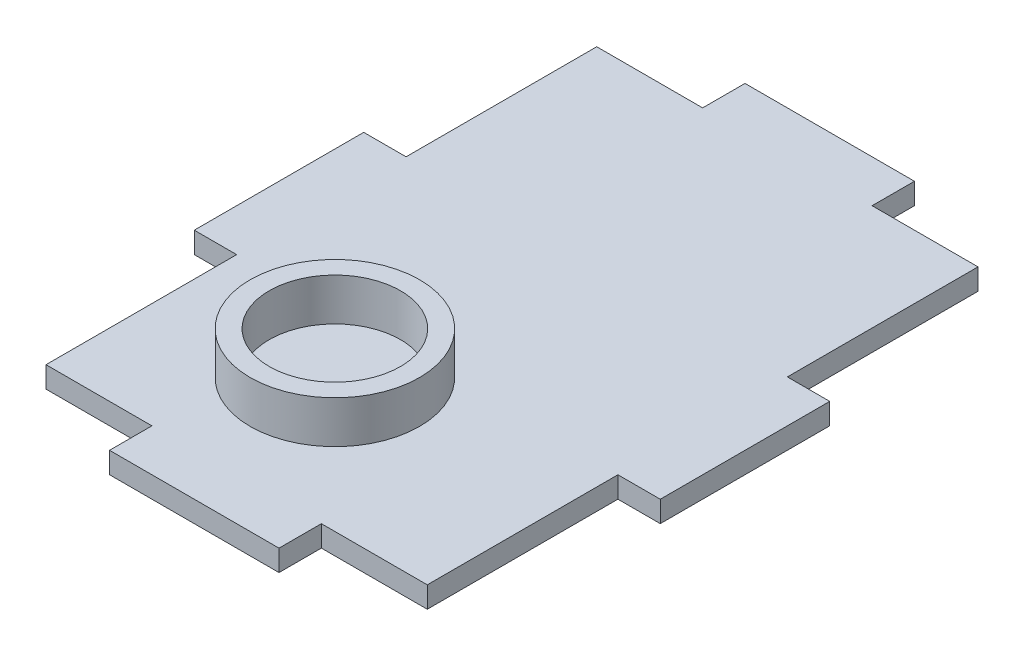
ISO-10303-21;
HEADER;
FILE_DESCRIPTION(('STEP AP214'),'2;1');
FILE_NAME('part.step','',(''),(''),'','','');
FILE_SCHEMA(('AUTOMOTIVE_DESIGN { 1 0 10303 214 1 1 1 1 }'));
ENDSEC;
DATA;
#1=APPLICATION_CONTEXT('core data for automotive mechanical design processes');
#2=APPLICATION_PROTOCOL_DEFINITION('international standard','automotive_design',2000,#1);
#3=PRODUCT_CONTEXT('',#1,'mechanical');
#4=PRODUCT('Part','Part','',(#3));
#5=PRODUCT_RELATED_PRODUCT_CATEGORY('part','',(#4));
#6=PRODUCT_DEFINITION_FORMATION('','',#4);
#7=PRODUCT_DEFINITION_CONTEXT('part definition',#1,'design');
#8=PRODUCT_DEFINITION('design','',#6,#7);
#9=PRODUCT_DEFINITION_SHAPE('','',#8);
#10=(LENGTH_UNIT() NAMED_UNIT(*) SI_UNIT(.MILLI.,.METRE.));
#11=(NAMED_UNIT(*) PLANE_ANGLE_UNIT() SI_UNIT($,.RADIAN.));
#12=(NAMED_UNIT(*) SI_UNIT($,.STERADIAN.) SOLID_ANGLE_UNIT());
#13=UNCERTAINTY_MEASURE_WITH_UNIT(LENGTH_MEASURE(1.E-05),#10,'distance_accuracy_value','');
#14=(GEOMETRIC_REPRESENTATION_CONTEXT(3) GLOBAL_UNCERTAINTY_ASSIGNED_CONTEXT((#13)) GLOBAL_UNIT_ASSIGNED_CONTEXT((#10,
#11,#12)) REPRESENTATION_CONTEXT('',''));
#15=CARTESIAN_POINT('',(0.,0.,0.));
#16=DIRECTION('',(0.,0.,1.));
#17=DIRECTION('',(1.,0.,0.));
#18=AXIS2_PLACEMENT_3D('',#15,#16,#17);
#19=CARTESIAN_POINT('',(0.,5.,0.));
#20=DIRECTION('',(-1.,0.,0.));
#21=DIRECTION('',(0.,0.,1.));
#22=AXIS2_PLACEMENT_3D('',#19,#20,#21);
#23=PLANE('',#22);
#24=DIRECTION('',(0.,0.,-1.));
#25=VECTOR('',#24,1.);
#26=CARTESIAN_POINT('',(0.,0.,0.));
#27=LINE('',#26,#25);
#28=CARTESIAN_POINT('',(0.,0.,0.));
#29=VERTEX_POINT('',#28);
#30=CARTESIAN_POINT('',(0.,0.,-45.));
#31=VERTEX_POINT('',#30);
#32=EDGE_CURVE('E163',#29,#31,#27,.T.);
#33=ORIENTED_EDGE('',*,*,#32,.F.);
#34=DIRECTION('',(0.,-1.,0.));
#35=VECTOR('',#34,1.);
#36=CARTESIAN_POINT('',(0.,5.,0.));
#37=LINE('',#36,#35);
#38=CARTESIAN_POINT('',(0.,5.,0.));
#39=VERTEX_POINT('',#38);
#40=EDGE_CURVE('E156',#39,#29,#37,.T.);
#41=ORIENTED_EDGE('',*,*,#40,.F.);
#42=DIRECTION('',(0.,0.,-1.));
#43=VECTOR('',#42,1.);
#44=CARTESIAN_POINT('',(0.,5.,0.));
#45=LINE('',#44,#43);
#46=CARTESIAN_POINT('',(0.,5.,-45.));
#47=VERTEX_POINT('',#46);
#48=EDGE_CURVE('E159',#39,#47,#45,.T.);
#49=ORIENTED_EDGE('',*,*,#48,.T.);
#50=DIRECTION('',(0.,-1.,0.));
#51=VECTOR('',#50,1.);
#52=CARTESIAN_POINT('',(0.,5.,-45.));
#53=LINE('',#52,#51);
#54=EDGE_CURVE('E153',#47,#31,#53,.T.);
#55=ORIENTED_EDGE('',*,*,#54,.T.);
#56=EDGE_LOOP('',(#33,#41,#49,#55));
#57=FACE_BOUND('',#56,.T.);
#58=ADVANCED_FACE('F35',(#57),#23,.T.);
#59=CARTESIAN_POINT('',(0.,5.,-45.));
#60=DIRECTION('',(0.,0.,1.));
#61=DIRECTION('',(1.,0.,0.));
#62=AXIS2_PLACEMENT_3D('',#59,#60,#61);
#63=PLANE('',#62);
#64=DIRECTION('',(-1.,0.,0.));
#65=VECTOR('',#64,1.);
#66=CARTESIAN_POINT('',(0.,0.,-45.));
#67=LINE('',#66,#65);
#68=CARTESIAN_POINT('',(-9.99999999999999,0.,-45.));
#69=VERTEX_POINT('',#68);
#70=EDGE_CURVE('E160',#31,#69,#67,.T.);
#71=ORIENTED_EDGE('',*,*,#70,.F.);
#72=ORIENTED_EDGE('',*,*,#54,.F.);
#73=DIRECTION('',(-1.,0.,0.));
#74=VECTOR('',#73,1.);
#75=CARTESIAN_POINT('',(0.,5.,-45.));
#76=LINE('',#75,#74);
#77=CARTESIAN_POINT('',(-9.99999999999999,5.,-45.));
#78=VERTEX_POINT('',#77);
#79=EDGE_CURVE('E201',#47,#78,#76,.T.);
#80=ORIENTED_EDGE('',*,*,#79,.T.);
#81=DIRECTION('',(0.,-1.,0.));
#82=VECTOR('',#81,1.);
#83=CARTESIAN_POINT('',(-9.99999999999999,5.,-45.));
#84=LINE('',#83,#82);
#85=EDGE_CURVE('E150',#78,#69,#84,.T.);
#86=ORIENTED_EDGE('',*,*,#85,.T.);
#87=EDGE_LOOP('',(#71,#72,#80,#86));
#88=FACE_BOUND('',#87,.T.);
#89=ADVANCED_FACE('F414',(#88),#63,.T.);
#90=CARTESIAN_POINT('',(-9.99999999999999,5.,0.));
#91=DIRECTION('',(1.,0.,0.));
#92=DIRECTION('',(0.,0.,-1.));
#93=AXIS2_PLACEMENT_3D('',#90,#91,#92);
#94=PLANE('',#93);
#95=DIRECTION('',(0.,0.,1.));
#96=VECTOR('',#95,1.);
#97=CARTESIAN_POINT('',(-9.99999999999999,0.,0.));
#98=LINE('',#97,#96);
#99=CARTESIAN_POINT('',(-9.99999999999999,0.,-85.));
#100=VERTEX_POINT('',#99);
#101=EDGE_CURVE('E164',#100,#69,#98,.T.);
#102=ORIENTED_EDGE('',*,*,#101,.T.);
#103=ORIENTED_EDGE('',*,*,#85,.F.);
#104=DIRECTION('',(0.,0.,1.));
#105=VECTOR('',#104,1.);
#106=CARTESIAN_POINT('',(-9.99999999999999,5.,0.));
#107=LINE('',#106,#105);
#108=CARTESIAN_POINT('',(-9.99999999999999,5.,-85.));
#109=VERTEX_POINT('',#108);
#110=EDGE_CURVE('E204',#109,#78,#107,.T.);
#111=ORIENTED_EDGE('',*,*,#110,.F.);
#112=DIRECTION('',(0.,-1.,0.));
#113=VECTOR('',#112,1.);
#114=CARTESIAN_POINT('',(-9.99999999999999,5.,-85.));
#115=LINE('',#114,#113);
#116=EDGE_CURVE('E147',#109,#100,#115,.T.);
#117=ORIENTED_EDGE('',*,*,#116,.T.);
#118=EDGE_LOOP('',(#102,#103,#111,#117));
#119=FACE_BOUND('',#118,.T.);
#120=ADVANCED_FACE('F420',(#119),#94,.F.);
#121=CARTESIAN_POINT('',(1.17961196366423E-13,5.,-85.));
#122=DIRECTION('',(0.,0.,1.));
#123=DIRECTION('',(1.,0.,0.));
#124=AXIS2_PLACEMENT_3D('',#121,#122,#123);
#125=PLANE('',#124);
#126=DIRECTION('',(-1.,0.,0.));
#127=VECTOR('',#126,1.);
#128=CARTESIAN_POINT('',(1.17961196366423E-13,0.,-85.));
#129=LINE('',#128,#127);
#130=CARTESIAN_POINT('',(0.,0.,-85.));
#131=VERTEX_POINT('',#130);
#132=EDGE_CURVE('E167',#131,#100,#129,.T.);
#133=ORIENTED_EDGE('',*,*,#132,.T.);
#134=ORIENTED_EDGE('',*,*,#116,.F.);
#135=DIRECTION('',(-1.,0.,0.));
#136=VECTOR('',#135,1.);
#137=CARTESIAN_POINT('',(1.17961196366423E-13,5.,-85.));
#138=LINE('',#137,#136);
#139=CARTESIAN_POINT('',(0.,5.,-85.));
#140=VERTEX_POINT('',#139);
#141=EDGE_CURVE('E207',#140,#109,#138,.T.);
#142=ORIENTED_EDGE('',*,*,#141,.F.);
#143=DIRECTION('',(0.,-1.,0.));
#144=VECTOR('',#143,1.);
#145=CARTESIAN_POINT('',(0.,5.,-85.));
#146=LINE('',#145,#144);
#147=EDGE_CURVE('E144',#140,#131,#146,.T.);
#148=ORIENTED_EDGE('',*,*,#147,.T.);
#149=EDGE_LOOP('',(#133,#134,#142,#148));
#150=FACE_BOUND('',#149,.T.);
#151=ADVANCED_FACE('F435',(#150),#125,.F.);
#152=CARTESIAN_POINT('',(1.17961196366423E-13,5.,-85.0000000000001));
#153=DIRECTION('',(0.,0.,-1.));
#154=DIRECTION('',(-1.,0.,0.));
#155=AXIS2_PLACEMENT_3D('',#152,#153,#154);
#156=PLANE('',#155);
#157=DIRECTION('',(1.,0.,0.));
#158=VECTOR('',#157,1.);
#159=CARTESIAN_POINT('',(1.17961196366423E-13,0.,-85.0000000000001));
#160=LINE('',#159,#158);
#161=CARTESIAN_POINT('',(90.,0.,-85.));
#162=VERTEX_POINT('',#161);
#163=CARTESIAN_POINT('',(100.,0.,-85.));
#164=VERTEX_POINT('',#163);
#165=EDGE_CURVE('E176',#162,#164,#160,.T.);
#166=ORIENTED_EDGE('',*,*,#165,.F.);
#167=DIRECTION('',(0.,-1.,0.));
#168=VECTOR('',#167,1.);
#169=CARTESIAN_POINT('',(90.,5.,-85.));
#170=LINE('',#169,#168);
#171=CARTESIAN_POINT('',(90.,5.,-85.));
#172=VERTEX_POINT('',#171);
#173=EDGE_CURVE('E135',#172,#162,#170,.T.);
#174=ORIENTED_EDGE('',*,*,#173,.F.);
#175=DIRECTION('',(1.,0.,0.));
#176=VECTOR('',#175,1.);
#177=CARTESIAN_POINT('',(1.17961196366423E-13,5.,-85.0000000000001));
#178=LINE('',#177,#176);
#179=CARTESIAN_POINT('',(100.,5.,-85.));
#180=VERTEX_POINT('',#179);
#181=EDGE_CURVE('E217',#172,#180,#178,.T.);
#182=ORIENTED_EDGE('',*,*,#181,.T.);
#183=DIRECTION('',(0.,-1.,0.));
#184=VECTOR('',#183,1.);
#185=CARTESIAN_POINT('',(100.,5.,-85.));
#186=LINE('',#185,#184);
#187=EDGE_CURVE('E132',#180,#164,#186,.T.);
#188=ORIENTED_EDGE('',*,*,#187,.T.);
#189=EDGE_LOOP('',(#166,#174,#182,#188));
#190=FACE_BOUND('',#189,.T.);
#191=ADVANCED_FACE('F396',(#190),#156,.T.);
#192=CARTESIAN_POINT('',(100.,5.,0.));
#193=DIRECTION('',(1.,0.,0.));
#194=DIRECTION('',(0.,0.,-1.));
#195=AXIS2_PLACEMENT_3D('',#192,#193,#194);
#196=PLANE('',#195);
#197=DIRECTION('',(0.,0.,1.));
#198=VECTOR('',#197,1.);
#199=CARTESIAN_POINT('',(100.,0.,0.));
#200=LINE('',#199,#198);
#201=CARTESIAN_POINT('',(100.,0.,-45.));
#202=VERTEX_POINT('',#201);
#203=EDGE_CURVE('E180',#164,#202,#200,.T.);
#204=ORIENTED_EDGE('',*,*,#203,.F.);
#205=ORIENTED_EDGE('',*,*,#187,.F.);
#206=DIRECTION('',(0.,0.,1.));
#207=VECTOR('',#206,1.);
#208=CARTESIAN_POINT('',(100.,5.,0.));
#209=LINE('',#208,#207);
#210=CARTESIAN_POINT('',(100.,5.,-45.));
#211=VERTEX_POINT('',#210);
#212=EDGE_CURVE('E221',#180,#211,#209,.T.);
#213=ORIENTED_EDGE('',*,*,#212,.T.);
#214=DIRECTION('',(0.,-1.,0.));
#215=VECTOR('',#214,1.);
#216=CARTESIAN_POINT('',(100.,5.,-45.));
#217=LINE('',#216,#215);
#218=EDGE_CURVE('E129',#211,#202,#217,.T.);
#219=ORIENTED_EDGE('',*,*,#218,.T.);
#220=EDGE_LOOP('',(#204,#205,#213,#219));
#221=FACE_BOUND('',#220,.T.);
#222=ADVANCED_FACE('F391',(#221),#196,.T.);
#223=CARTESIAN_POINT('',(0.,5.,-45.));
#224=DIRECTION('',(0.,0.,-1.));
#225=DIRECTION('',(-1.,0.,0.));
#226=AXIS2_PLACEMENT_3D('',#223,#224,#225);
#227=PLANE('',#226);
#228=DIRECTION('',(1.,0.,0.));
#229=VECTOR('',#228,1.);
#230=CARTESIAN_POINT('',(0.,0.,-45.));
#231=LINE('',#230,#229);
#232=CARTESIAN_POINT('',(90.,0.,-45.));
#233=VERTEX_POINT('',#232);
#234=EDGE_CURVE('E183',#233,#202,#231,.T.);
#235=ORIENTED_EDGE('',*,*,#234,.T.);
#236=ORIENTED_EDGE('',*,*,#218,.F.);
#237=DIRECTION('',(1.,0.,0.));
#238=VECTOR('',#237,1.);
#239=CARTESIAN_POINT('',(0.,5.,-45.));
#240=LINE('',#239,#238);
#241=CARTESIAN_POINT('',(90.,5.,-45.));
#242=VERTEX_POINT('',#241);
#243=EDGE_CURVE('E224',#242,#211,#240,.T.);
#244=ORIENTED_EDGE('',*,*,#243,.F.);
#245=DIRECTION('',(0.,-1.,0.));
#246=VECTOR('',#245,1.);
#247=CARTESIAN_POINT('',(90.,5.,-45.));
#248=LINE('',#247,#246);
#249=EDGE_CURVE('E126',#242,#233,#248,.T.);
#250=ORIENTED_EDGE('',*,*,#249,.T.);
#251=EDGE_LOOP('',(#235,#236,#244,#250));
#252=FACE_BOUND('',#251,.T.);
#253=ADVANCED_FACE('F388',(#252),#227,.F.);
#254=CARTESIAN_POINT('',(90.,5.,0.));
#255=DIRECTION('',(-1.,0.,0.));
#256=DIRECTION('',(0.,0.,1.));
#257=AXIS2_PLACEMENT_3D('',#254,#255,#256);
#258=PLANE('',#257);
#259=DIRECTION('',(0.,0.,-1.));
#260=VECTOR('',#259,1.);
#261=CARTESIAN_POINT('',(90.,0.,0.));
#262=LINE('',#261,#260);
#263=CARTESIAN_POINT('',(90.,0.,0.));
#264=VERTEX_POINT('',#263);
#265=EDGE_CURVE('E186',#264,#233,#262,.T.);
#266=ORIENTED_EDGE('',*,*,#265,.T.);
#267=ORIENTED_EDGE('',*,*,#249,.F.);
#268=DIRECTION('',(0.,0.,-1.));
#269=VECTOR('',#268,1.);
#270=CARTESIAN_POINT('',(90.,5.,0.));
#271=LINE('',#270,#269);
#272=CARTESIAN_POINT('',(90.,5.,0.));
#273=VERTEX_POINT('',#272);
#274=EDGE_CURVE('E227',#273,#242,#271,.T.);
#275=ORIENTED_EDGE('',*,*,#274,.F.);
#276=DIRECTION('',(0.,-1.,0.));
#277=VECTOR('',#276,1.);
#278=CARTESIAN_POINT('',(90.,5.,0.));
#279=LINE('',#278,#277);
#280=EDGE_CURVE('E123',#273,#264,#279,.T.);
#281=ORIENTED_EDGE('',*,*,#280,.T.);
#282=EDGE_LOOP('',(#266,#267,#275,#281));
#283=FACE_BOUND('',#282,.T.);
#284=ADVANCED_FACE('F384',(#283),#258,.F.);
#285=CARTESIAN_POINT('',(0.,5.,0.));
#286=DIRECTION('',(0.,0.,-1.));
#287=DIRECTION('',(-1.,0.,0.));
#288=AXIS2_PLACEMENT_3D('',#285,#286,#287);
#289=PLANE('',#288);
#290=DIRECTION('',(1.,0.,0.));
#291=VECTOR('',#290,1.);
#292=CARTESIAN_POINT('',(0.,0.,0.));
#293=LINE('',#292,#291);
#294=CARTESIAN_POINT('',(65.,0.,0.));
#295=VERTEX_POINT('',#294);
#296=EDGE_CURVE('E189',#295,#264,#293,.T.);
#297=ORIENTED_EDGE('',*,*,#296,.T.);
#298=ORIENTED_EDGE('',*,*,#280,.F.);
#299=DIRECTION('',(1.,0.,0.));
#300=VECTOR('',#299,1.);
#301=CARTESIAN_POINT('',(0.,5.,0.));
#302=LINE('',#301,#300);
#303=CARTESIAN_POINT('',(65.,5.,0.));
#304=VERTEX_POINT('',#303);
#305=EDGE_CURVE('E230',#304,#273,#302,.T.);
#306=ORIENTED_EDGE('',*,*,#305,.F.);
#307=DIRECTION('',(0.,-1.,0.));
#308=VECTOR('',#307,1.);
#309=CARTESIAN_POINT('',(65.,5.,0.));
#310=LINE('',#309,#308);
#311=EDGE_CURVE('E120',#304,#295,#310,.T.);
#312=ORIENTED_EDGE('',*,*,#311,.T.);
#313=EDGE_LOOP('',(#297,#298,#306,#312));
#314=FACE_BOUND('',#313,.T.);
#315=ADVANCED_FACE('F377',(#314),#289,.F.);
#316=CARTESIAN_POINT('',(65.,5.,0.));
#317=DIRECTION('',(1.,0.,0.));
#318=DIRECTION('',(0.,0.,-1.));
#319=AXIS2_PLACEMENT_3D('',#316,#317,#318);
#320=PLANE('',#319);
#321=DIRECTION('',(0.,0.,1.));
#322=VECTOR('',#321,1.);
#323=CARTESIAN_POINT('',(65.,0.,0.));
#324=LINE('',#323,#322);
#325=CARTESIAN_POINT('',(65.,0.,10.));
#326=VERTEX_POINT('',#325);
#327=EDGE_CURVE('E190',#295,#326,#324,.T.);
#328=ORIENTED_EDGE('',*,*,#327,.F.);
#329=ORIENTED_EDGE('',*,*,#311,.F.);
#330=DIRECTION('',(0.,0.,1.));
#331=VECTOR('',#330,1.);
#332=CARTESIAN_POINT('',(65.,5.,0.));
#333=LINE('',#332,#331);
#334=CARTESIAN_POINT('',(65.,5.,10.));
#335=VERTEX_POINT('',#334);
#336=EDGE_CURVE('E231',#304,#335,#333,.T.);
#337=ORIENTED_EDGE('',*,*,#336,.T.);
#338=DIRECTION('',(0.,-1.,0.));
#339=VECTOR('',#338,1.);
#340=CARTESIAN_POINT('',(65.,5.,10.));
#341=LINE('',#340,#339);
#342=EDGE_CURVE('E117',#335,#326,#341,.T.);
#343=ORIENTED_EDGE('',*,*,#342,.T.);
#344=EDGE_LOOP('',(#328,#329,#337,#343));
#345=FACE_BOUND('',#344,.T.);
#346=ADVANCED_FACE('F372',(#345),#320,.T.);
#347=CARTESIAN_POINT('',(0.,5.,10.));
#348=DIRECTION('',(0.,0.,1.));
#349=DIRECTION('',(1.,0.,0.));
#350=AXIS2_PLACEMENT_3D('',#347,#348,#349);
#351=PLANE('',#350);
#352=DIRECTION('',(-1.,0.,0.));
#353=VECTOR('',#352,1.);
#354=CARTESIAN_POINT('',(0.,0.,10.));
#355=LINE('',#354,#353);
#356=CARTESIAN_POINT('',(25.,0.,10.));
#357=VERTEX_POINT('',#356);
#358=EDGE_CURVE('E193',#326,#357,#355,.T.);
#359=ORIENTED_EDGE('',*,*,#358,.F.);
#360=ORIENTED_EDGE('',*,*,#342,.F.);
#361=DIRECTION('',(-1.,0.,0.));
#362=VECTOR('',#361,1.);
#363=CARTESIAN_POINT('',(0.,5.,10.));
#364=LINE('',#363,#362);
#365=CARTESIAN_POINT('',(25.,5.,10.));
#366=VERTEX_POINT('',#365);
#367=EDGE_CURVE('E234',#335,#366,#364,.T.);
#368=ORIENTED_EDGE('',*,*,#367,.T.);
#369=DIRECTION('',(0.,-1.,0.));
#370=VECTOR('',#369,1.);
#371=CARTESIAN_POINT('',(25.,5.,10.));
#372=LINE('',#371,#370);
#373=EDGE_CURVE('E114',#366,#357,#372,.T.);
#374=ORIENTED_EDGE('',*,*,#373,.T.);
#375=EDGE_LOOP('',(#359,#360,#368,#374));
#376=FACE_BOUND('',#375,.T.);
#377=ADVANCED_FACE('F368',(#376),#351,.T.);
#378=CARTESIAN_POINT('',(25.,5.,0.));
#379=DIRECTION('',(1.,0.,0.));
#380=DIRECTION('',(0.,0.,-1.));
#381=AXIS2_PLACEMENT_3D('',#378,#379,#380);
#382=PLANE('',#381);
#383=DIRECTION('',(0.,0.,1.));
#384=VECTOR('',#383,1.);
#385=CARTESIAN_POINT('',(25.,0.,0.));
#386=LINE('',#385,#384);
#387=CARTESIAN_POINT('',(25.,0.,0.));
#388=VERTEX_POINT('',#387);
#389=EDGE_CURVE('E196',#388,#357,#386,.T.);
#390=ORIENTED_EDGE('',*,*,#389,.T.);
#391=ORIENTED_EDGE('',*,*,#373,.F.);
#392=DIRECTION('',(0.,0.,1.));
#393=VECTOR('',#392,1.);
#394=CARTESIAN_POINT('',(25.,5.,0.));
#395=LINE('',#394,#393);
#396=CARTESIAN_POINT('',(25.,5.,0.));
#397=VERTEX_POINT('',#396);
#398=EDGE_CURVE('E237',#397,#366,#395,.T.);
#399=ORIENTED_EDGE('',*,*,#398,.F.);
#400=DIRECTION('',(0.,-1.,0.));
#401=VECTOR('',#400,1.);
#402=CARTESIAN_POINT('',(25.,5.,0.));
#403=LINE('',#402,#401);
#404=EDGE_CURVE('E105',#397,#388,#403,.T.);
#405=ORIENTED_EDGE('',*,*,#404,.T.);
#406=EDGE_LOOP('',(#390,#391,#399,#405));
#407=FACE_BOUND('',#406,.T.);
#408=ADVANCED_FACE('F288',(#407),#382,.F.);
#409=EDGE_CURVE('E84',#29,#388,#293,.T.);
#410=ORIENTED_EDGE('',*,*,#409,.T.);
#411=ORIENTED_EDGE('',*,*,#404,.F.);
#412=EDGE_CURVE('E240',#39,#397,#302,.T.);
#413=ORIENTED_EDGE('',*,*,#412,.F.);
#414=ORIENTED_EDGE('',*,*,#40,.T.);
#415=EDGE_LOOP('',(#410,#411,#413,#414));
#416=FACE_BOUND('',#415,.T.);
#417=ADVANCED_FACE('F286',(#416),#289,.F.);
#418=CARTESIAN_POINT('',(90.,0.,-130.));
#419=VERTEX_POINT('',#418);
#420=EDGE_CURVE('E179',#162,#419,#262,.T.);
#421=ORIENTED_EDGE('',*,*,#420,.T.);
#422=DIRECTION('',(0.,-1.,0.));
#423=VECTOR('',#422,1.);
#424=CARTESIAN_POINT('',(90.,5.,-130.));
#425=LINE('',#424,#423);
#426=CARTESIAN_POINT('',(90.,5.,-130.));
#427=VERTEX_POINT('',#426);
#428=EDGE_CURVE('E138',#427,#419,#425,.T.);
#429=ORIENTED_EDGE('',*,*,#428,.F.);
#430=EDGE_CURVE('E220',#172,#427,#271,.T.);
#431=ORIENTED_EDGE('',*,*,#430,.F.);
#432=ORIENTED_EDGE('',*,*,#173,.T.);
#433=EDGE_LOOP('',(#421,#429,#431,#432));
#434=FACE_BOUND('',#433,.T.);
#435=ADVANCED_FACE('F402',(#434),#258,.F.);
#436=CARTESIAN_POINT('',(0.,0.,-130.));
#437=VERTEX_POINT('',#436);
#438=EDGE_CURVE('E170',#131,#437,#27,.T.);
#439=ORIENTED_EDGE('',*,*,#438,.F.);
#440=ORIENTED_EDGE('',*,*,#147,.F.);
#441=CARTESIAN_POINT('',(0.,5.,-130.));
#442=VERTEX_POINT('',#441);
#443=EDGE_CURVE('E210',#140,#442,#45,.T.);
#444=ORIENTED_EDGE('',*,*,#443,.T.);
#445=DIRECTION('',(0.,-1.,0.));
#446=VECTOR('',#445,1.);
#447=CARTESIAN_POINT('',(0.,5.,-130.));
#448=LINE('',#447,#446);
#449=EDGE_CURVE('E141',#442,#437,#448,.T.);
#450=ORIENTED_EDGE('',*,*,#449,.T.);
#451=EDGE_LOOP('',(#439,#440,#444,#450));
#452=FACE_BOUND('',#451,.T.);
#453=ADVANCED_FACE('F416',(#452),#23,.T.);
#454=CARTESIAN_POINT('',(0.,0.,0.));
#455=DIRECTION('',(0.,1.,0.));
#456=DIRECTION('',(0.,0.,1.));
#457=AXIS2_PLACEMENT_3D('',#454,#455,#456);
#458=PLANE('',#457);
#459=ORIENTED_EDGE('',*,*,#409,.F.);
#460=ORIENTED_EDGE('',*,*,#32,.T.);
#461=ORIENTED_EDGE('',*,*,#70,.T.);
#462=ORIENTED_EDGE('',*,*,#101,.F.);
#463=ORIENTED_EDGE('',*,*,#132,.F.);
#464=ORIENTED_EDGE('',*,*,#438,.T.);
#465=DIRECTION('',(1.,0.,0.));
#466=VECTOR('',#465,1.);
#467=CARTESIAN_POINT('',(0.,0.,-130.));
#468=LINE('',#467,#466);
#469=CARTESIAN_POINT('',(25.,0.,-130.));
#470=VERTEX_POINT('',#469);
#471=EDGE_CURVE('E173',#437,#470,#468,.T.);
#472=ORIENTED_EDGE('',*,*,#471,.T.);
#473=DIRECTION('',(0.,0.,-1.));
#474=VECTOR('',#473,1.);
#475=CARTESIAN_POINT('',(25.,0.,-130.));
#476=LINE('',#475,#474);
#477=CARTESIAN_POINT('',(25.,0.,-140.));
#478=VERTEX_POINT('',#477);
#479=EDGE_CURVE('E96',#470,#478,#476,.T.);
#480=ORIENTED_EDGE('',*,*,#479,.T.);
#481=DIRECTION('',(1.,0.,0.));
#482=VECTOR('',#481,1.);
#483=CARTESIAN_POINT('',(25.,0.,-140.));
#484=LINE('',#483,#482);
#485=CARTESIAN_POINT('',(65.,0.,-140.));
#486=VERTEX_POINT('',#485);
#487=EDGE_CURVE('E79',#478,#486,#484,.T.);
#488=ORIENTED_EDGE('',*,*,#487,.T.);
#489=DIRECTION('',(0.,0.,-1.));
#490=VECTOR('',#489,1.);
#491=CARTESIAN_POINT('',(65.,0.,-130.));
#492=LINE('',#491,#490);
#493=CARTESIAN_POINT('',(65.,0.,-130.));
#494=VERTEX_POINT('',#493);
#495=EDGE_CURVE('E87',#494,#486,#492,.T.);
#496=ORIENTED_EDGE('',*,*,#495,.F.);
#497=EDGE_CURVE('E175',#494,#419,#468,.T.);
#498=ORIENTED_EDGE('',*,*,#497,.T.);
#499=ORIENTED_EDGE('',*,*,#420,.F.);
#500=ORIENTED_EDGE('',*,*,#165,.T.);
#501=ORIENTED_EDGE('',*,*,#203,.T.);
#502=ORIENTED_EDGE('',*,*,#234,.F.);
#503=ORIENTED_EDGE('',*,*,#265,.F.);
#504=ORIENTED_EDGE('',*,*,#296,.F.);
#505=ORIENTED_EDGE('',*,*,#327,.T.);
#506=ORIENTED_EDGE('',*,*,#358,.T.);
#507=ORIENTED_EDGE('',*,*,#389,.F.);
#508=EDGE_LOOP('',(#459,#460,#461,#462,#463,#464,#472,#480,#488,#496,#498,#499,#500,#501,#502,
#503,#504,#505,#506,#507));
#509=FACE_BOUND('',#508,.T.);
#510=ADVANCED_FACE('F94',(#509),#458,.F.);
#511=CARTESIAN_POINT('',(0.,5.,0.));
#512=DIRECTION('',(0.,1.,0.));
#513=DIRECTION('',(0.,0.,1.));
#514=AXIS2_PLACEMENT_3D('',#511,#512,#513);
#515=PLANE('',#514);
#516=CARTESIAN_POINT('',(36.72,5.,-31.47));
#517=DIRECTION('',(0.,1.,0.));
#518=DIRECTION('',(0.,0.,1.));
#519=AXIS2_PLACEMENT_3D('',#516,#517,#518);
#520=CIRCLE('',#519,20.);
#521=CARTESIAN_POINT('',(36.72,5.,-11.47));
#522=VERTEX_POINT('',#521);
#523=EDGE_CURVE('E243',#522,#522,#520,.T.);
#524=ORIENTED_EDGE('',*,*,#523,.F.);
#525=EDGE_LOOP('',(#524));
#526=FACE_BOUND('',#525,.T.);
#527=ORIENTED_EDGE('',*,*,#412,.T.);
#528=ORIENTED_EDGE('',*,*,#398,.T.);
#529=ORIENTED_EDGE('',*,*,#367,.F.);
#530=ORIENTED_EDGE('',*,*,#336,.F.);
#531=ORIENTED_EDGE('',*,*,#305,.T.);
#532=ORIENTED_EDGE('',*,*,#274,.T.);
#533=ORIENTED_EDGE('',*,*,#243,.T.);
#534=ORIENTED_EDGE('',*,*,#212,.F.);
#535=ORIENTED_EDGE('',*,*,#181,.F.);
#536=ORIENTED_EDGE('',*,*,#430,.T.);
#537=DIRECTION('',(1.,0.,0.));
#538=VECTOR('',#537,1.);
#539=CARTESIAN_POINT('',(0.,5.,-130.));
#540=LINE('',#539,#538);
#541=CARTESIAN_POINT('',(65.,5.,-130.));
#542=VERTEX_POINT('',#541);
#543=EDGE_CURVE('E216',#542,#427,#540,.T.);
#544=ORIENTED_EDGE('',*,*,#543,.F.);
#545=DIRECTION('',(0.,0.,-1.));
#546=VECTOR('',#545,1.);
#547=CARTESIAN_POINT('',(65.,5.,-130.));
#548=LINE('',#547,#546);
#549=CARTESIAN_POINT('',(65.,5.,-140.));
#550=VERTEX_POINT('',#549);
#551=EDGE_CURVE('E106',#542,#550,#548,.T.);
#552=ORIENTED_EDGE('',*,*,#551,.T.);
#553=DIRECTION('',(1.,0.,0.));
#554=VECTOR('',#553,1.);
#555=CARTESIAN_POINT('',(25.,5.,-140.));
#556=LINE('',#555,#554);
#557=CARTESIAN_POINT('',(25.,5.,-140.));
#558=VERTEX_POINT('',#557);
#559=EDGE_CURVE('E82',#558,#550,#556,.T.);
#560=ORIENTED_EDGE('',*,*,#559,.F.);
#561=DIRECTION('',(0.,0.,-1.));
#562=VECTOR('',#561,1.);
#563=CARTESIAN_POINT('',(25.,5.,-130.));
#564=LINE('',#563,#562);
#565=CARTESIAN_POINT('',(25.,5.,-130.));
#566=VERTEX_POINT('',#565);
#567=EDGE_CURVE('E91',#566,#558,#564,.T.);
#568=ORIENTED_EDGE('',*,*,#567,.F.);
#569=EDGE_CURVE('E213',#442,#566,#540,.T.);
#570=ORIENTED_EDGE('',*,*,#569,.F.);
#571=ORIENTED_EDGE('',*,*,#443,.F.);
#572=ORIENTED_EDGE('',*,*,#141,.T.);
#573=ORIENTED_EDGE('',*,*,#110,.T.);
#574=ORIENTED_EDGE('',*,*,#79,.F.);
#575=ORIENTED_EDGE('',*,*,#48,.F.);
#576=EDGE_LOOP('',(#527,#528,#529,#530,#531,#532,#533,#534,#535,#536,#544,#552,#560,#568,#570,
#571,#572,#573,#574,#575));
#577=FACE_BOUND('',#576,.T.);
#578=ADVANCED_FACE('F268',(#526,#577),#515,.T.);
#579=CARTESIAN_POINT('',(0.,5.,-130.));
#580=DIRECTION('',(0.,0.,-1.));
#581=DIRECTION('',(-1.,0.,0.));
#582=AXIS2_PLACEMENT_3D('',#579,#580,#581);
#583=PLANE('',#582);
#584=ORIENTED_EDGE('',*,*,#569,.T.);
#585=DIRECTION('',(0.,-1.,0.));
#586=VECTOR('',#585,1.);
#587=CARTESIAN_POINT('',(25.,5.,-130.));
#588=LINE('',#587,#586);
#589=EDGE_CURVE('E102',#566,#470,#588,.T.);
#590=ORIENTED_EDGE('',*,*,#589,.T.);
#591=ORIENTED_EDGE('',*,*,#471,.F.);
#592=ORIENTED_EDGE('',*,*,#449,.F.);
#593=EDGE_LOOP('',(#584,#590,#591,#592));
#594=FACE_BOUND('',#593,.T.);
#595=ADVANCED_FACE('F270',(#594),#583,.T.);
#596=DIRECTION('',(0.,-1.,0.));
#597=VECTOR('',#596,1.);
#598=CARTESIAN_POINT('',(65.,5.,-130.));
#599=LINE('',#598,#597);
#600=EDGE_CURVE('E44',#542,#494,#599,.T.);
#601=ORIENTED_EDGE('',*,*,#600,.F.);
#602=ORIENTED_EDGE('',*,*,#543,.T.);
#603=ORIENTED_EDGE('',*,*,#428,.T.);
#604=ORIENTED_EDGE('',*,*,#497,.F.);
#605=EDGE_LOOP('',(#601,#602,#603,#604));
#606=FACE_BOUND('',#605,.T.);
#607=ADVANCED_FACE('F403',(#606),#583,.T.);
#608=CARTESIAN_POINT('',(25.,5.,-140.));
#609=DIRECTION('',(0.,0.,-1.));
#610=DIRECTION('',(-1.,0.,0.));
#611=AXIS2_PLACEMENT_3D('',#608,#609,#610);
#612=PLANE('',#611);
#613=ORIENTED_EDGE('',*,*,#487,.F.);
#614=DIRECTION('',(0.,-1.,0.));
#615=VECTOR('',#614,1.);
#616=CARTESIAN_POINT('',(25.,5.,-140.));
#617=LINE('',#616,#615);
#618=EDGE_CURVE('E69',#558,#478,#617,.T.);
#619=ORIENTED_EDGE('',*,*,#618,.F.);
#620=ORIENTED_EDGE('',*,*,#559,.T.);
#621=DIRECTION('',(0.,-1.,0.));
#622=VECTOR('',#621,1.);
#623=CARTESIAN_POINT('',(65.,5.,-140.));
#624=LINE('',#623,#622);
#625=EDGE_CURVE('E75',#550,#486,#624,.T.);
#626=ORIENTED_EDGE('',*,*,#625,.T.);
#627=EDGE_LOOP('',(#613,#619,#620,#626));
#628=FACE_BOUND('',#627,.T.);
#629=ADVANCED_FACE('F77',(#628),#612,.T.);
#630=CARTESIAN_POINT('',(25.,5.,-130.));
#631=DIRECTION('',(-1.,0.,0.));
#632=DIRECTION('',(0.,0.,1.));
#633=AXIS2_PLACEMENT_3D('',#630,#631,#632);
#634=PLANE('',#633);
#635=ORIENTED_EDGE('',*,*,#479,.F.);
#636=ORIENTED_EDGE('',*,*,#589,.F.);
#637=ORIENTED_EDGE('',*,*,#567,.T.);
#638=ORIENTED_EDGE('',*,*,#618,.T.);
#639=EDGE_LOOP('',(#635,#636,#637,#638));
#640=FACE_BOUND('',#639,.T.);
#641=ADVANCED_FACE('F37',(#640),#634,.T.);
#642=CARTESIAN_POINT('',(65.,5.,-130.));
#643=DIRECTION('',(-1.,0.,0.));
#644=DIRECTION('',(0.,0.,1.));
#645=AXIS2_PLACEMENT_3D('',#642,#643,#644);
#646=PLANE('',#645);
#647=ORIENTED_EDGE('',*,*,#495,.T.);
#648=ORIENTED_EDGE('',*,*,#625,.F.);
#649=ORIENTED_EDGE('',*,*,#551,.F.);
#650=ORIENTED_EDGE('',*,*,#600,.T.);
#651=EDGE_LOOP('',(#647,#648,#649,#650));
#652=FACE_BOUND('',#651,.T.);
#653=ADVANCED_FACE('F88',(#652),#646,.F.);
#654=CARTESIAN_POINT('',(36.72,15.,-31.47));
#655=DIRECTION('',(0.,-1.,0.));
#656=DIRECTION('',(0.,0.,-1.));
#657=AXIS2_PLACEMENT_3D('',#654,#655,#656);
#658=CYLINDRICAL_SURFACE('',#657,15.5);
#659=CARTESIAN_POINT('',(36.72,15.,-31.47));
#660=DIRECTION('',(0.,1.,0.));
#661=DIRECTION('',(0.,0.,1.));
#662=AXIS2_PLACEMENT_3D('',#659,#660,#661);
#663=CIRCLE('',#662,15.5);
#664=CARTESIAN_POINT('',(36.72,15.,-15.97));
#665=VERTEX_POINT('',#664);
#666=EDGE_CURVE('E246',#665,#665,#663,.T.);
#667=ORIENTED_EDGE('',*,*,#666,.T.);
#668=EDGE_LOOP('',(#667));
#669=FACE_BOUND('',#668,.T.);
#670=CARTESIAN_POINT('',(36.72,5.,-31.47));
#671=DIRECTION('',(0.,1.,0.));
#672=DIRECTION('',(0.,0.,1.));
#673=AXIS2_PLACEMENT_3D('',#670,#671,#672);
#674=CIRCLE('',#673,15.5);
#675=CARTESIAN_POINT('',(36.72,5.,-15.97));
#676=VERTEX_POINT('',#675);
#677=EDGE_CURVE('E11',#676,#676,#674,.F.);
#678=ORIENTED_EDGE('',*,*,#677,.T.);
#679=EDGE_LOOP('',(#678));
#680=FACE_BOUND('',#679,.T.);
#681=ADVANCED_FACE('F252',(#669,#680),#658,.F.);
#682=CARTESIAN_POINT('',(36.72,15.,-31.47));
#683=DIRECTION('',(0.,-1.,0.));
#684=DIRECTION('',(0.,0.,-1.));
#685=AXIS2_PLACEMENT_3D('',#682,#683,#684);
#686=CYLINDRICAL_SURFACE('',#685,20.);
#687=CARTESIAN_POINT('',(36.72,15.,-31.47));
#688=DIRECTION('',(0.,1.,0.));
#689=DIRECTION('',(0.,0.,1.));
#690=AXIS2_PLACEMENT_3D('',#687,#688,#689);
#691=CIRCLE('',#690,20.);
#692=CARTESIAN_POINT('',(36.72,15.,-11.47));
#693=VERTEX_POINT('',#692);
#694=EDGE_CURVE('E98',#693,#693,#691,.T.);
#695=ORIENTED_EDGE('',*,*,#694,.F.);
#696=EDGE_LOOP('',(#695));
#697=FACE_BOUND('',#696,.T.);
#698=ORIENTED_EDGE('',*,*,#523,.T.);
#699=EDGE_LOOP('',(#698));
#700=FACE_BOUND('',#699,.T.);
#701=ADVANCED_FACE('F259',(#697,#700),#686,.T.);
#702=CARTESIAN_POINT('',(0.,15.,0.));
#703=DIRECTION('',(0.,1.,0.));
#704=DIRECTION('',(0.,0.,1.));
#705=AXIS2_PLACEMENT_3D('',#702,#703,#704);
#706=PLANE('',#705);
#707=ORIENTED_EDGE('',*,*,#666,.F.);
#708=EDGE_LOOP('',(#707));
#709=FACE_BOUND('',#708,.T.);
#710=ORIENTED_EDGE('',*,*,#694,.T.);
#711=EDGE_LOOP('',(#710));
#712=FACE_BOUND('',#711,.T.);
#713=ADVANCED_FACE('F255',(#709,#712),#706,.T.);
#714=ORIENTED_EDGE('',*,*,#677,.F.);
#715=EDGE_LOOP('',(#714));
#716=FACE_BOUND('',#715,.T.);
#717=ADVANCED_FACE('F258',(#716),#515,.T.);
#718=CLOSED_SHELL('',(#58,#89,#120,#151,#191,#222,#253,#284,#315,#346,#377,#408,#417,#435,#453,
#510,#578,#595,#607,#629,#641,#653,#681,#701,#713,#717));
#719=MANIFOLD_SOLID_BREP('B2',#718);
#720=ADVANCED_BREP_SHAPE_REPRESENTATION('',(#18,#719),#14);
#721=SHAPE_DEFINITION_REPRESENTATION(#9,#720);
ENDSEC;
END-ISO-10303-21;
